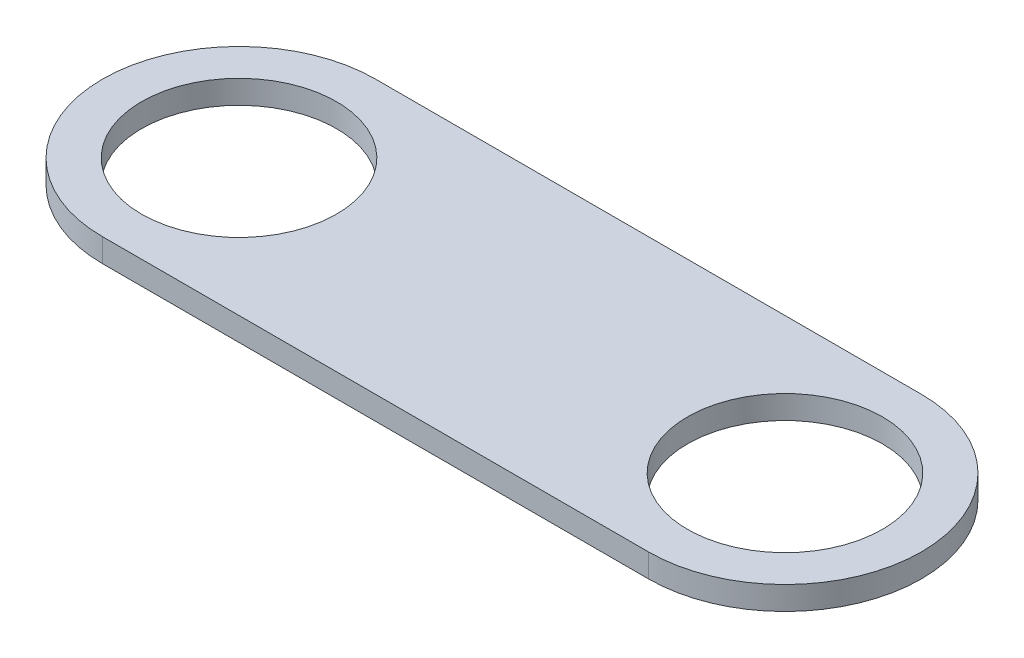
ISO-10303-21;
HEADER;
FILE_DESCRIPTION(('STEP AP214'),'2;1');
FILE_NAME('part.step','',(''),(''),'','','');
FILE_SCHEMA(('AUTOMOTIVE_DESIGN { 1 0 10303 214 1 1 1 1 }'));
ENDSEC;
DATA;
#1=APPLICATION_CONTEXT('core data for automotive mechanical design processes');
#2=APPLICATION_PROTOCOL_DEFINITION('international standard','automotive_design',2000,#1);
#3=PRODUCT_CONTEXT('',#1,'mechanical');
#4=PRODUCT('Part','Part','',(#3));
#5=PRODUCT_RELATED_PRODUCT_CATEGORY('part','',(#4));
#6=PRODUCT_DEFINITION_FORMATION('','',#4);
#7=PRODUCT_DEFINITION_CONTEXT('part definition',#1,'design');
#8=PRODUCT_DEFINITION('design','',#6,#7);
#9=PRODUCT_DEFINITION_SHAPE('','',#8);
#10=(LENGTH_UNIT() NAMED_UNIT(*) SI_UNIT(.MILLI.,.METRE.));
#11=(NAMED_UNIT(*) PLANE_ANGLE_UNIT() SI_UNIT($,.RADIAN.));
#12=(NAMED_UNIT(*) SI_UNIT($,.STERADIAN.) SOLID_ANGLE_UNIT());
#13=UNCERTAINTY_MEASURE_WITH_UNIT(LENGTH_MEASURE(1.E-05),#10,'distance_accuracy_value','');
#14=(GEOMETRIC_REPRESENTATION_CONTEXT(3) GLOBAL_UNCERTAINTY_ASSIGNED_CONTEXT((#13)) GLOBAL_UNIT_ASSIGNED_CONTEXT((#10,
#11,#12)) REPRESENTATION_CONTEXT('',''));
#15=CARTESIAN_POINT('',(0.,0.,0.));
#16=DIRECTION('',(0.,0.,1.));
#17=DIRECTION('',(1.,0.,0.));
#18=AXIS2_PLACEMENT_3D('',#15,#16,#17);
#19=CARTESIAN_POINT('',(-35.,3.,17.5));
#20=DIRECTION('',(0.,-1.,0.));
#21=DIRECTION('',(0.,0.,-1.));
#22=AXIS2_PLACEMENT_3D('',#19,#20,#21);
#23=CYLINDRICAL_SURFACE('',#22,17.5);
#24=CARTESIAN_POINT('',(-35.,0.,17.5));
#25=DIRECTION('',(0.,1.,0.));
#26=DIRECTION('',(0.,0.,1.));
#27=AXIS2_PLACEMENT_3D('',#24,#25,#26);
#28=CIRCLE('',#27,17.5);
#29=CARTESIAN_POINT('',(-35.,0.,0.));
#30=VERTEX_POINT('',#29);
#31=CARTESIAN_POINT('',(-35.,0.,35.));
#32=VERTEX_POINT('',#31);
#33=EDGE_CURVE('E96',#30,#32,#28,.T.);
#34=ORIENTED_EDGE('',*,*,#33,.T.);
#35=DIRECTION('',(0.,-1.,0.));
#36=VECTOR('',#35,1.);
#37=CARTESIAN_POINT('',(-35.,3.,35.));
#38=LINE('',#37,#36);
#39=CARTESIAN_POINT('',(-35.,3.,35.));
#40=VERTEX_POINT('',#39);
#41=EDGE_CURVE('E11',#40,#32,#38,.T.);
#42=ORIENTED_EDGE('',*,*,#41,.F.);
#43=CARTESIAN_POINT('',(-35.,3.,17.5));
#44=DIRECTION('',(0.,1.,0.));
#45=DIRECTION('',(0.,0.,1.));
#46=AXIS2_PLACEMENT_3D('',#43,#44,#45);
#47=CIRCLE('',#46,17.5);
#48=CARTESIAN_POINT('',(-35.,3.,0.));
#49=VERTEX_POINT('',#48);
#50=EDGE_CURVE('E84',#49,#40,#47,.T.);
#51=ORIENTED_EDGE('',*,*,#50,.F.);
#52=DIRECTION('',(0.,-1.,0.));
#53=VECTOR('',#52,1.);
#54=CARTESIAN_POINT('',(-35.,3.,0.));
#55=LINE('',#54,#53);
#56=EDGE_CURVE('E92',#49,#30,#55,.T.);
#57=ORIENTED_EDGE('',*,*,#56,.T.);
#58=EDGE_LOOP('',(#34,#42,#51,#57));
#59=FACE_BOUND('',#58,.T.);
#60=ADVANCED_FACE('F33',(#59),#23,.T.);
#61=CARTESIAN_POINT('',(-35.,3.,35.));
#62=DIRECTION('',(0.,0.,-1.));
#63=DIRECTION('',(-1.,0.,0.));
#64=AXIS2_PLACEMENT_3D('',#61,#62,#63);
#65=PLANE('',#64);
#66=DIRECTION('',(1.,0.,0.));
#67=VECTOR('',#66,1.);
#68=CARTESIAN_POINT('',(-35.,0.,35.));
#69=LINE('',#68,#67);
#70=CARTESIAN_POINT('',(35.,0.,35.));
#71=VERTEX_POINT('',#70);
#72=EDGE_CURVE('E88',#32,#71,#69,.T.);
#73=ORIENTED_EDGE('',*,*,#72,.T.);
#74=DIRECTION('',(0.,-1.,0.));
#75=VECTOR('',#74,1.);
#76=CARTESIAN_POINT('',(35.,3.,35.));
#77=LINE('',#76,#75);
#78=CARTESIAN_POINT('',(35.,3.,35.));
#79=VERTEX_POINT('',#78);
#80=EDGE_CURVE('E41',#79,#71,#77,.T.);
#81=ORIENTED_EDGE('',*,*,#80,.F.);
#82=DIRECTION('',(1.,0.,0.));
#83=VECTOR('',#82,1.);
#84=CARTESIAN_POINT('',(-35.,3.,35.));
#85=LINE('',#84,#83);
#86=EDGE_CURVE('E79',#40,#79,#85,.T.);
#87=ORIENTED_EDGE('',*,*,#86,.F.);
#88=ORIENTED_EDGE('',*,*,#41,.T.);
#89=EDGE_LOOP('',(#73,#81,#87,#88));
#90=FACE_BOUND('',#89,.T.);
#91=ADVANCED_FACE('F87',(#90),#65,.F.);
#92=CARTESIAN_POINT('',(35.,3.,17.5));
#93=DIRECTION('',(0.,-1.,0.));
#94=DIRECTION('',(0.,0.,-1.));
#95=AXIS2_PLACEMENT_3D('',#92,#93,#94);
#96=CYLINDRICAL_SURFACE('',#95,17.5);
#97=CARTESIAN_POINT('',(35.,0.,17.5));
#98=DIRECTION('',(0.,1.,0.));
#99=DIRECTION('',(0.,0.,1.));
#100=AXIS2_PLACEMENT_3D('',#97,#98,#99);
#101=CIRCLE('',#100,17.5);
#102=CARTESIAN_POINT('',(35.,0.,0.));
#103=VERTEX_POINT('',#102);
#104=EDGE_CURVE('E66',#71,#103,#101,.T.);
#105=ORIENTED_EDGE('',*,*,#104,.T.);
#106=DIRECTION('',(0.,-1.,0.));
#107=VECTOR('',#106,1.);
#108=CARTESIAN_POINT('',(35.,3.,0.));
#109=LINE('',#108,#107);
#110=CARTESIAN_POINT('',(35.,3.,0.));
#111=VERTEX_POINT('',#110);
#112=EDGE_CURVE('E89',#111,#103,#109,.T.);
#113=ORIENTED_EDGE('',*,*,#112,.F.);
#114=CARTESIAN_POINT('',(35.,3.,17.5));
#115=DIRECTION('',(0.,1.,0.));
#116=DIRECTION('',(0.,0.,1.));
#117=AXIS2_PLACEMENT_3D('',#114,#115,#116);
#118=CIRCLE('',#117,17.5);
#119=EDGE_CURVE('E82',#79,#111,#118,.T.);
#120=ORIENTED_EDGE('',*,*,#119,.F.);
#121=ORIENTED_EDGE('',*,*,#80,.T.);
#122=EDGE_LOOP('',(#105,#113,#120,#121));
#123=FACE_BOUND('',#122,.T.);
#124=ADVANCED_FACE('F90',(#123),#96,.T.);
#125=CARTESIAN_POINT('',(35.,3.,0.));
#126=DIRECTION('',(0.,0.,1.));
#127=DIRECTION('',(1.,0.,0.));
#128=AXIS2_PLACEMENT_3D('',#125,#126,#127);
#129=PLANE('',#128);
#130=DIRECTION('',(-1.,0.,0.));
#131=VECTOR('',#130,1.);
#132=CARTESIAN_POINT('',(35.,0.,0.));
#133=LINE('',#132,#131);
#134=EDGE_CURVE('E72',#103,#30,#133,.T.);
#135=ORIENTED_EDGE('',*,*,#134,.T.);
#136=ORIENTED_EDGE('',*,*,#56,.F.);
#137=DIRECTION('',(-1.,0.,0.));
#138=VECTOR('',#137,1.);
#139=CARTESIAN_POINT('',(35.,3.,0.));
#140=LINE('',#139,#138);
#141=EDGE_CURVE('E49',#111,#49,#140,.T.);
#142=ORIENTED_EDGE('',*,*,#141,.F.);
#143=ORIENTED_EDGE('',*,*,#112,.T.);
#144=EDGE_LOOP('',(#135,#136,#142,#143));
#145=FACE_BOUND('',#144,.T.);
#146=ADVANCED_FACE('F104',(#145),#129,.F.);
#147=CARTESIAN_POINT('',(-35.,3.,17.5));
#148=DIRECTION('',(0.,1.,0.));
#149=DIRECTION('',(0.,0.,1.));
#150=AXIS2_PLACEMENT_3D('',#147,#148,#149);
#151=PLANE('',#150);
#152=CARTESIAN_POINT('',(-35.,3.,17.5));
#153=DIRECTION('',(0.,1.,0.));
#154=DIRECTION('',(0.,0.,1.));
#155=AXIS2_PLACEMENT_3D('',#152,#153,#154);
#156=CIRCLE('',#155,12.5);
#157=CARTESIAN_POINT('',(-35.,3.,30.));
#158=VERTEX_POINT('',#157);
#159=EDGE_CURVE('E116',#158,#158,#156,.T.);
#160=ORIENTED_EDGE('',*,*,#159,.F.);
#161=EDGE_LOOP('',(#160));
#162=FACE_BOUND('',#161,.T.);
#163=CARTESIAN_POINT('',(35.,3.,17.5));
#164=DIRECTION('',(0.,1.,0.));
#165=DIRECTION('',(0.,0.,-1.));
#166=AXIS2_PLACEMENT_3D('',#163,#164,#165);
#167=CIRCLE('',#166,12.5);
#168=CARTESIAN_POINT('',(35.,3.,5.));
#169=VERTEX_POINT('',#168);
#170=EDGE_CURVE('E110',#169,#169,#167,.T.);
#171=ORIENTED_EDGE('',*,*,#170,.F.);
#172=EDGE_LOOP('',(#171));
#173=FACE_BOUND('',#172,.T.);
#174=ORIENTED_EDGE('',*,*,#50,.T.);
#175=ORIENTED_EDGE('',*,*,#86,.T.);
#176=ORIENTED_EDGE('',*,*,#119,.T.);
#177=ORIENTED_EDGE('',*,*,#141,.T.);
#178=EDGE_LOOP('',(#174,#175,#176,#177));
#179=FACE_BOUND('',#178,.T.);
#180=ADVANCED_FACE('F80',(#162,#173,#179),#151,.T.);
#181=CARTESIAN_POINT('',(-35.,0.,17.5));
#182=DIRECTION('',(0.,1.,0.));
#183=DIRECTION('',(0.,0.,1.));
#184=AXIS2_PLACEMENT_3D('',#181,#182,#183);
#185=PLANE('',#184);
#186=CARTESIAN_POINT('',(-35.,0.,17.5));
#187=DIRECTION('',(0.,1.,0.));
#188=DIRECTION('',(0.,0.,1.));
#189=AXIS2_PLACEMENT_3D('',#186,#187,#188);
#190=CIRCLE('',#189,12.5);
#191=CARTESIAN_POINT('',(-35.,0.,30.));
#192=VERTEX_POINT('',#191);
#193=EDGE_CURVE('E99',#192,#192,#190,.T.);
#194=ORIENTED_EDGE('',*,*,#193,.T.);
#195=EDGE_LOOP('',(#194));
#196=FACE_BOUND('',#195,.T.);
#197=CARTESIAN_POINT('',(35.,0.,17.5));
#198=DIRECTION('',(0.,1.,0.));
#199=DIRECTION('',(0.,0.,-1.));
#200=AXIS2_PLACEMENT_3D('',#197,#198,#199);
#201=CIRCLE('',#200,12.5);
#202=CARTESIAN_POINT('',(35.,0.,5.));
#203=VERTEX_POINT('',#202);
#204=EDGE_CURVE('E113',#203,#203,#201,.T.);
#205=ORIENTED_EDGE('',*,*,#204,.T.);
#206=EDGE_LOOP('',(#205));
#207=FACE_BOUND('',#206,.T.);
#208=ORIENTED_EDGE('',*,*,#33,.F.);
#209=ORIENTED_EDGE('',*,*,#134,.F.);
#210=ORIENTED_EDGE('',*,*,#104,.F.);
#211=ORIENTED_EDGE('',*,*,#72,.F.);
#212=EDGE_LOOP('',(#208,#209,#210,#211));
#213=FACE_BOUND('',#212,.T.);
#214=ADVANCED_FACE('F107',(#196,#207,#213),#185,.F.);
#215=CARTESIAN_POINT('',(35.,0.,17.5));
#216=DIRECTION('',(0.,1.,0.));
#217=DIRECTION('',(0.,0.,1.));
#218=AXIS2_PLACEMENT_3D('',#215,#216,#217);
#219=CYLINDRICAL_SURFACE('',#218,12.5);
#220=ORIENTED_EDGE('',*,*,#204,.F.);
#221=EDGE_LOOP('',(#220));
#222=FACE_BOUND('',#221,.T.);
#223=ORIENTED_EDGE('',*,*,#170,.T.);
#224=EDGE_LOOP('',(#223));
#225=FACE_BOUND('',#224,.T.);
#226=ADVANCED_FACE('F127',(#222,#225),#219,.F.);
#227=CARTESIAN_POINT('',(-35.,0.,17.5));
#228=DIRECTION('',(0.,1.,0.));
#229=DIRECTION('',(0.,0.,1.));
#230=AXIS2_PLACEMENT_3D('',#227,#228,#229);
#231=CYLINDRICAL_SURFACE('',#230,12.5);
#232=ORIENTED_EDGE('',*,*,#193,.F.);
#233=EDGE_LOOP('',(#232));
#234=FACE_BOUND('',#233,.T.);
#235=ORIENTED_EDGE('',*,*,#159,.T.);
#236=EDGE_LOOP('',(#235));
#237=FACE_BOUND('',#236,.T.);
#238=ADVANCED_FACE('F124',(#234,#237),#231,.F.);
#239=CLOSED_SHELL('',(#60,#91,#124,#146,#180,#214,#226,#238));
#240=MANIFOLD_SOLID_BREP('B2',#239);
#241=ADVANCED_BREP_SHAPE_REPRESENTATION('',(#18,#240),#14);
#242=SHAPE_DEFINITION_REPRESENTATION(#9,#241);
ENDSEC;
END-ISO-10303-21;
